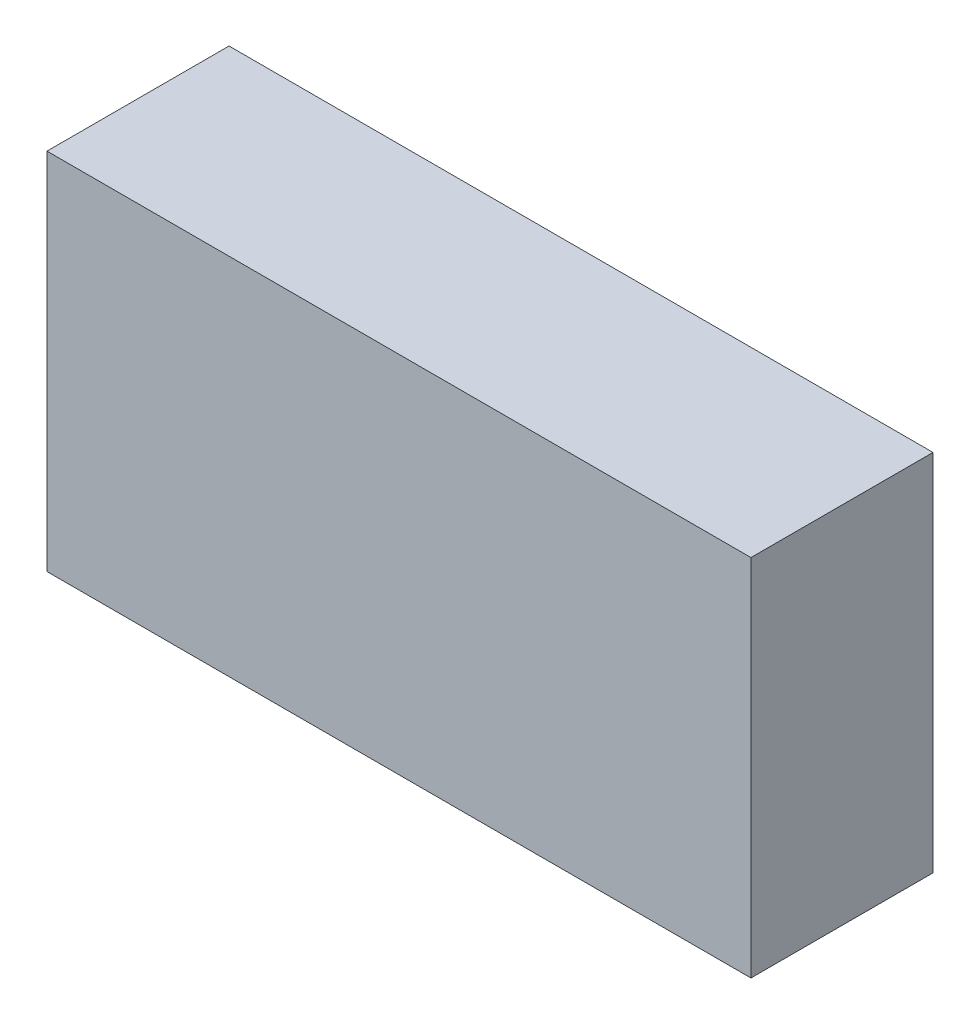
ISO-10303-21;
HEADER;
FILE_DESCRIPTION(('STEP AP214'),'2;1');
FILE_NAME('part.step','',(''),(''),'','','');
FILE_SCHEMA(('AUTOMOTIVE_DESIGN { 1 0 10303 214 1 1 1 1 }'));
ENDSEC;
DATA;
#1=APPLICATION_CONTEXT('core data for automotive mechanical design processes');
#2=APPLICATION_PROTOCOL_DEFINITION('international standard','automotive_design',2000,#1);
#3=PRODUCT_CONTEXT('',#1,'mechanical');
#4=PRODUCT('Part','Part','',(#3));
#5=PRODUCT_RELATED_PRODUCT_CATEGORY('part','',(#4));
#6=PRODUCT_DEFINITION_FORMATION('','',#4);
#7=PRODUCT_DEFINITION_CONTEXT('part definition',#1,'design');
#8=PRODUCT_DEFINITION('design','',#6,#7);
#9=PRODUCT_DEFINITION_SHAPE('','',#8);
#10=(LENGTH_UNIT() NAMED_UNIT(*) SI_UNIT(.MILLI.,.METRE.));
#11=(NAMED_UNIT(*) PLANE_ANGLE_UNIT() SI_UNIT($,.RADIAN.));
#12=(NAMED_UNIT(*) SI_UNIT($,.STERADIAN.) SOLID_ANGLE_UNIT());
#13=UNCERTAINTY_MEASURE_WITH_UNIT(LENGTH_MEASURE(1.E-05),#10,'distance_accuracy_value','');
#14=(GEOMETRIC_REPRESENTATION_CONTEXT(3) GLOBAL_UNCERTAINTY_ASSIGNED_CONTEXT((#13)) GLOBAL_UNIT_ASSIGNED_CONTEXT((#10,
#11,#12)) REPRESENTATION_CONTEXT('',''));
#15=CARTESIAN_POINT('',(0.,0.,0.));
#16=DIRECTION('',(0.,0.,1.));
#17=DIRECTION('',(1.,0.,0.));
#18=AXIS2_PLACEMENT_3D('',#15,#16,#17);
#19=CARTESIAN_POINT('',(-1.49,0.,40.));
#20=DIRECTION('',(0.,0.,1.));
#21=DIRECTION('',(1.,0.,0.));
#22=AXIS2_PLACEMENT_3D('',#19,#20,#21);
#23=PLANE('',#22);
#24=DIRECTION('',(1.,0.,0.));
#25=VECTOR('',#24,1.);
#26=CARTESIAN_POINT('',(-30.49,-15.,40.));
#27=LINE('',#26,#25);
#28=CARTESIAN_POINT('',(-30.49,-15.,40.));
#29=VERTEX_POINT('',#28);
#30=CARTESIAN_POINT('',(27.51,-15.,40.));
#31=VERTEX_POINT('',#30);
#32=EDGE_CURVE('E78',#29,#31,#27,.T.);
#33=ORIENTED_EDGE('',*,*,#32,.T.);
#34=DIRECTION('',(0.,1.,0.));
#35=VECTOR('',#34,1.);
#36=CARTESIAN_POINT('',(27.51,-15.,40.));
#37=LINE('',#36,#35);
#38=CARTESIAN_POINT('',(27.51,15.,40.));
#39=VERTEX_POINT('',#38);
#40=EDGE_CURVE('E98',#31,#39,#37,.T.);
#41=ORIENTED_EDGE('',*,*,#40,.T.);
#42=DIRECTION('',(-1.,0.,0.));
#43=VECTOR('',#42,1.);
#44=CARTESIAN_POINT('',(27.51,15.,40.));
#45=LINE('',#44,#43);
#46=CARTESIAN_POINT('',(-30.49,15.,40.));
#47=VERTEX_POINT('',#46);
#48=EDGE_CURVE('E71',#39,#47,#45,.T.);
#49=ORIENTED_EDGE('',*,*,#48,.T.);
#50=DIRECTION('',(0.,-1.,0.));
#51=VECTOR('',#50,1.);
#52=CARTESIAN_POINT('',(-30.49,15.,40.));
#53=LINE('',#52,#51);
#54=EDGE_CURVE('E9',#47,#29,#53,.T.);
#55=ORIENTED_EDGE('',*,*,#54,.T.);
#56=EDGE_LOOP('',(#33,#41,#49,#55));
#57=FACE_BOUND('',#56,.T.);
#58=ADVANCED_FACE('F15',(#57),#23,.T.);
#59=CARTESIAN_POINT('',(-1.49,0.,25.));
#60=DIRECTION('',(0.,0.,1.));
#61=DIRECTION('',(1.,0.,0.));
#62=AXIS2_PLACEMENT_3D('',#59,#60,#61);
#63=PLANE('',#62);
#64=DIRECTION('',(0.,-1.,0.));
#65=VECTOR('',#64,1.);
#66=CARTESIAN_POINT('',(-30.49,15.,25.));
#67=LINE('',#66,#65);
#68=CARTESIAN_POINT('',(-30.49,15.,25.));
#69=VERTEX_POINT('',#68);
#70=CARTESIAN_POINT('',(-30.49,-15.,25.));
#71=VERTEX_POINT('',#70);
#72=EDGE_CURVE('E23',#69,#71,#67,.T.);
#73=ORIENTED_EDGE('',*,*,#72,.F.);
#74=DIRECTION('',(-1.,0.,0.));
#75=VECTOR('',#74,1.);
#76=CARTESIAN_POINT('',(27.51,15.,25.));
#77=LINE('',#76,#75);
#78=CARTESIAN_POINT('',(27.51,15.,25.));
#79=VERTEX_POINT('',#78);
#80=EDGE_CURVE('E92',#79,#69,#77,.T.);
#81=ORIENTED_EDGE('',*,*,#80,.F.);
#82=DIRECTION('',(0.,1.,0.));
#83=VECTOR('',#82,1.);
#84=CARTESIAN_POINT('',(27.51,-15.,25.));
#85=LINE('',#84,#83);
#86=CARTESIAN_POINT('',(27.51,-15.,25.));
#87=VERTEX_POINT('',#86);
#88=EDGE_CURVE('E81',#87,#79,#85,.T.);
#89=ORIENTED_EDGE('',*,*,#88,.F.);
#90=DIRECTION('',(1.,0.,0.));
#91=VECTOR('',#90,1.);
#92=CARTESIAN_POINT('',(-30.49,-15.,25.));
#93=LINE('',#92,#91);
#94=EDGE_CURVE('E80',#71,#87,#93,.T.);
#95=ORIENTED_EDGE('',*,*,#94,.F.);
#96=EDGE_LOOP('',(#73,#81,#89,#95));
#97=FACE_BOUND('',#96,.T.);
#98=ADVANCED_FACE('F83',(#97),#63,.F.);
#99=CARTESIAN_POINT('',(-30.49,15.,25.));
#100=DIRECTION('',(1.,0.,0.));
#101=DIRECTION('',(0.,1.,0.));
#102=AXIS2_PLACEMENT_3D('',#99,#100,#101);
#103=PLANE('',#102);
#104=ORIENTED_EDGE('',*,*,#72,.T.);
#105=DIRECTION('',(0.,0.,1.));
#106=VECTOR('',#105,1.);
#107=CARTESIAN_POINT('',(-30.49,-15.,25.));
#108=LINE('',#107,#106);
#109=EDGE_CURVE('E66',#71,#29,#108,.T.);
#110=ORIENTED_EDGE('',*,*,#109,.T.);
#111=ORIENTED_EDGE('',*,*,#54,.F.);
#112=DIRECTION('',(0.,0.,1.));
#113=VECTOR('',#112,1.);
#114=CARTESIAN_POINT('',(-30.49,15.,25.));
#115=LINE('',#114,#113);
#116=EDGE_CURVE('E67',#69,#47,#115,.T.);
#117=ORIENTED_EDGE('',*,*,#116,.F.);
#118=EDGE_LOOP('',(#104,#110,#111,#117));
#119=FACE_BOUND('',#118,.T.);
#120=ADVANCED_FACE('F65',(#119),#103,.F.);
#121=CARTESIAN_POINT('',(27.51,15.,25.));
#122=DIRECTION('',(0.,-1.,0.));
#123=DIRECTION('',(0.,0.,-1.));
#124=AXIS2_PLACEMENT_3D('',#121,#122,#123);
#125=PLANE('',#124);
#126=ORIENTED_EDGE('',*,*,#80,.T.);
#127=ORIENTED_EDGE('',*,*,#116,.T.);
#128=ORIENTED_EDGE('',*,*,#48,.F.);
#129=DIRECTION('',(0.,0.,1.));
#130=VECTOR('',#129,1.);
#131=CARTESIAN_POINT('',(27.51,15.,25.));
#132=LINE('',#131,#130);
#133=EDGE_CURVE('E103',#79,#39,#132,.T.);
#134=ORIENTED_EDGE('',*,*,#133,.F.);
#135=EDGE_LOOP('',(#126,#127,#128,#134));
#136=FACE_BOUND('',#135,.T.);
#137=ADVANCED_FACE('F113',(#136),#125,.F.);
#138=CARTESIAN_POINT('',(27.51,-15.,25.));
#139=DIRECTION('',(-1.,0.,0.));
#140=DIRECTION('',(0.,0.,1.));
#141=AXIS2_PLACEMENT_3D('',#138,#139,#140);
#142=PLANE('',#141);
#143=ORIENTED_EDGE('',*,*,#88,.T.);
#144=ORIENTED_EDGE('',*,*,#133,.T.);
#145=ORIENTED_EDGE('',*,*,#40,.F.);
#146=DIRECTION('',(0.,0.,1.));
#147=VECTOR('',#146,1.);
#148=CARTESIAN_POINT('',(27.51,-15.,25.));
#149=LINE('',#148,#147);
#150=EDGE_CURVE('E87',#87,#31,#149,.T.);
#151=ORIENTED_EDGE('',*,*,#150,.F.);
#152=EDGE_LOOP('',(#143,#144,#145,#151));
#153=FACE_BOUND('',#152,.T.);
#154=ADVANCED_FACE('F119',(#153),#142,.F.);
#155=CARTESIAN_POINT('',(-30.49,-15.,25.));
#156=DIRECTION('',(0.,1.,0.));
#157=DIRECTION('',(1.,0.,0.));
#158=AXIS2_PLACEMENT_3D('',#155,#156,#157);
#159=PLANE('',#158);
#160=ORIENTED_EDGE('',*,*,#94,.T.);
#161=ORIENTED_EDGE('',*,*,#150,.T.);
#162=ORIENTED_EDGE('',*,*,#32,.F.);
#163=ORIENTED_EDGE('',*,*,#109,.F.);
#164=EDGE_LOOP('',(#160,#161,#162,#163));
#165=FACE_BOUND('',#164,.T.);
#166=ADVANCED_FACE('F74',(#165),#159,.F.);
#167=CLOSED_SHELL('',(#58,#98,#120,#137,#154,#166));
#168=MANIFOLD_SOLID_BREP('B1',#167);
#169=ADVANCED_BREP_SHAPE_REPRESENTATION('',(#18,#168),#14);
#170=SHAPE_DEFINITION_REPRESENTATION(#9,#169);
ENDSEC;
END-ISO-10303-21;
